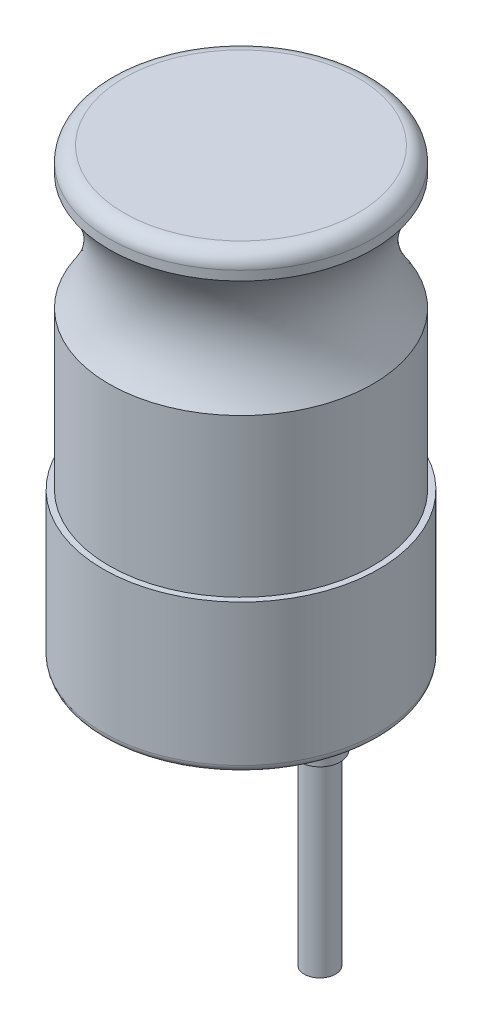
ISO-10303-21;
HEADER;
FILE_DESCRIPTION(('STEP AP214'),'2;1');
FILE_NAME('part.step','',(''),(''),'','','');
FILE_SCHEMA(('AUTOMOTIVE_DESIGN { 1 0 10303 214 1 1 1 1 }'));
ENDSEC;
DATA;
#1=APPLICATION_CONTEXT('core data for automotive mechanical design processes');
#2=APPLICATION_PROTOCOL_DEFINITION('international standard','automotive_design',2000,#1);
#3=PRODUCT_CONTEXT('',#1,'mechanical');
#4=PRODUCT('Part','Part','',(#3));
#5=PRODUCT_RELATED_PRODUCT_CATEGORY('part','',(#4));
#6=PRODUCT_DEFINITION_FORMATION('','',#4);
#7=PRODUCT_DEFINITION_CONTEXT('part definition',#1,'design');
#8=PRODUCT_DEFINITION('design','',#6,#7);
#9=PRODUCT_DEFINITION_SHAPE('','',#8);
#10=(LENGTH_UNIT() NAMED_UNIT(*) SI_UNIT(.MILLI.,.METRE.));
#11=(NAMED_UNIT(*) PLANE_ANGLE_UNIT() SI_UNIT($,.RADIAN.));
#12=(NAMED_UNIT(*) SI_UNIT($,.STERADIAN.) SOLID_ANGLE_UNIT());
#13=UNCERTAINTY_MEASURE_WITH_UNIT(LENGTH_MEASURE(1.E-05),#10,'distance_accuracy_value','');
#14=(GEOMETRIC_REPRESENTATION_CONTEXT(3) GLOBAL_UNCERTAINTY_ASSIGNED_CONTEXT((#13)) GLOBAL_UNIT_ASSIGNED_CONTEXT((#10,
#11,#12)) REPRESENTATION_CONTEXT('',''));
#15=CARTESIAN_POINT('',(0.,0.,0.));
#16=DIRECTION('',(0.,0.,1.));
#17=DIRECTION('',(1.,0.,0.));
#18=AXIS2_PLACEMENT_3D('',#15,#16,#17);
#19=CARTESIAN_POINT('',(0.,60.,0.));
#20=DIRECTION('',(0.,-1.,0.));
#21=DIRECTION('',(0.,0.,-1.));
#22=AXIS2_PLACEMENT_3D('',#19,#20,#21);
#23=CYLINDRICAL_SURFACE('',#22,17.7082900717388);
#24=CARTESIAN_POINT('',(0.,20.,0.));
#25=DIRECTION('',(0.,1.,0.));
#26=DIRECTION('',(0.,0.,1.));
#27=AXIS2_PLACEMENT_3D('',#24,#25,#26);
#28=CIRCLE('',#27,17.7082900717388);
#29=CARTESIAN_POINT('',(0.,20.,17.7082900717388));
#30=VERTEX_POINT('',#29);
#31=EDGE_CURVE('E123',#30,#30,#28,.T.);
#32=ORIENTED_EDGE('',*,*,#31,.T.);
#33=EDGE_LOOP('',(#32));
#34=FACE_BOUND('',#33,.T.);
#35=CARTESIAN_POINT('',(0.,41.1183189695657,0.));
#36=DIRECTION('',(0.,1.,0.));
#37=DIRECTION('',(0.,0.,1.));
#38=AXIS2_PLACEMENT_3D('',#35,#36,#37);
#39=CIRCLE('',#38,17.7082900717388);
#40=CARTESIAN_POINT('',(0.,41.1183189695657,17.7082900717388));
#41=VERTEX_POINT('',#40);
#42=EDGE_CURVE('E53',#41,#41,#39,.T.);
#43=ORIENTED_EDGE('',*,*,#42,.F.);
#44=EDGE_LOOP('',(#43));
#45=FACE_BOUND('',#44,.T.);
#46=ADVANCED_FACE('F32',(#34,#45),#23,.T.);
#47=CARTESIAN_POINT('',(0.,20.,0.));
#48=DIRECTION('',(0.,-1.,0.));
#49=DIRECTION('',(0.,0.,-1.));
#50=AXIS2_PLACEMENT_3D('',#47,#48,#49);
#51=CYLINDRICAL_SURFACE('',#50,18.5);
#52=CARTESIAN_POINT('',(0.,1.,0.));
#53=DIRECTION('',(0.,1.,0.));
#54=DIRECTION('',(0.,0.,1.));
#55=AXIS2_PLACEMENT_3D('',#52,#53,#54);
#56=CIRCLE('',#55,18.5);
#57=CARTESIAN_POINT('',(0.,1.,18.5));
#58=VERTEX_POINT('',#57);
#59=EDGE_CURVE('E43',#58,#58,#56,.T.);
#60=ORIENTED_EDGE('',*,*,#59,.T.);
#61=EDGE_LOOP('',(#60));
#62=FACE_BOUND('',#61,.T.);
#63=CARTESIAN_POINT('',(0.,20.,0.));
#64=DIRECTION('',(0.,1.,0.));
#65=DIRECTION('',(0.,0.,1.));
#66=AXIS2_PLACEMENT_3D('',#63,#64,#65);
#67=CIRCLE('',#66,18.5);
#68=CARTESIAN_POINT('',(0.,20.,18.5));
#69=VERTEX_POINT('',#68);
#70=EDGE_CURVE('E134',#69,#69,#67,.T.);
#71=ORIENTED_EDGE('',*,*,#70,.F.);
#72=EDGE_LOOP('',(#71));
#73=FACE_BOUND('',#72,.T.);
#74=ADVANCED_FACE('F101',(#62,#73),#51,.T.);
#75=CARTESIAN_POINT('',(0.,20.,0.));
#76=DIRECTION('',(0.,1.,0.));
#77=DIRECTION('',(0.,0.,1.));
#78=AXIS2_PLACEMENT_3D('',#75,#76,#77);
#79=PLANE('',#78);
#80=ORIENTED_EDGE('',*,*,#31,.F.);
#81=EDGE_LOOP('',(#80));
#82=FACE_BOUND('',#81,.T.);
#83=ORIENTED_EDGE('',*,*,#70,.T.);
#84=EDGE_LOOP('',(#83));
#85=FACE_BOUND('',#84,.T.);
#86=ADVANCED_FACE('F98',(#82,#85),#79,.T.);
#87=CARTESIAN_POINT('',(0.,0.,0.));
#88=DIRECTION('',(0.,1.,0.));
#89=DIRECTION('',(0.,0.,1.));
#90=AXIS2_PLACEMENT_3D('',#87,#88,#89);
#91=PLANE('',#90);
#92=CARTESIAN_POINT('',(10.5836515385587,0.,0.));
#93=DIRECTION('',(0.,1.,0.));
#94=DIRECTION('',(0.,0.,1.));
#95=AXIS2_PLACEMENT_3D('',#92,#93,#94);
#96=CIRCLE('',#95,2.74870760067832);
#97=CARTESIAN_POINT('',(10.5836515385587,0.,2.74870760067832));
#98=VERTEX_POINT('',#97);
#99=EDGE_CURVE('E10',#98,#98,#96,.F.);
#100=ORIENTED_EDGE('',*,*,#99,.F.);
#101=EDGE_LOOP('',(#100));
#102=FACE_BOUND('',#101,.T.);
#103=CARTESIAN_POINT('',(0.,0.,0.));
#104=DIRECTION('',(0.,1.,0.));
#105=DIRECTION('',(0.,0.,1.));
#106=AXIS2_PLACEMENT_3D('',#103,#104,#105);
#107=CIRCLE('',#106,17.5);
#108=CARTESIAN_POINT('',(0.,0.,17.5));
#109=VERTEX_POINT('',#108);
#110=EDGE_CURVE('E39',#109,#109,#107,.F.);
#111=ORIENTED_EDGE('',*,*,#110,.T.);
#112=EDGE_LOOP('',(#111));
#113=FACE_BOUND('',#112,.T.);
#114=ADVANCED_FACE('F78',(#102,#113),#91,.F.);
#115=CARTESIAN_POINT('',(0.,56.7534358715261,17.7082900717388));
#116=CARTESIAN_POINT('',(0.,49.2397613994028,12.0887296047305));
#117=CARTESIAN_POINT('',(0.,41.1183189695657,17.7082900717388));
#118=B_SPLINE_CURVE_WITH_KNOTS('',2,(#115,#116,#117),.UNSPECIFIED.,.F.,.F.,(3,3),(0.,1.),.UNSPECIFIED.);
#119=CARTESIAN_POINT('',(0.,60.,0.));
#120=DIRECTION('',(0.,1.,0.));
#121=AXIS1_PLACEMENT('',#119,#120);
#122=SURFACE_OF_REVOLUTION('',#118,#121);
#123=ORIENTED_EDGE('',*,*,#42,.T.);
#124=EDGE_LOOP('',(#123));
#125=FACE_BOUND('',#124,.T.);
#126=CARTESIAN_POINT('',(0.,56.7534358715261,0.));
#127=DIRECTION('',(0.,1.,0.));
#128=DIRECTION('',(0.,0.,1.));
#129=AXIS2_PLACEMENT_3D('',#126,#127,#128);
#130=CIRCLE('',#129,17.7082900717388);
#131=CARTESIAN_POINT('',(0.,56.7534358715261,17.7082900717388));
#132=VERTEX_POINT('',#131);
#133=EDGE_CURVE('E58',#132,#132,#130,.T.);
#134=ORIENTED_EDGE('',*,*,#133,.F.);
#135=EDGE_LOOP('',(#134));
#136=FACE_BOUND('',#135,.T.);
#137=ADVANCED_FACE('F73',(#125,#136),#122,.F.);
#138=CARTESIAN_POINT('',(0.,60.,0.));
#139=DIRECTION('',(0.,1.,0.));
#140=DIRECTION('',(0.,0.,1.));
#141=AXIS2_PLACEMENT_3D('',#138,#139,#140);
#142=PLANE('',#141);
#143=CARTESIAN_POINT('',(0.,60.,0.));
#144=DIRECTION('',(0.,1.,0.));
#145=DIRECTION('',(0.,0.,1.));
#146=AXIS2_PLACEMENT_3D('',#143,#144,#145);
#147=CIRCLE('',#146,15.7082900717388);
#148=CARTESIAN_POINT('',(0.,60.,15.7082900717388));
#149=VERTEX_POINT('',#148);
#150=EDGE_CURVE('E137',#149,#149,#147,.T.);
#151=ORIENTED_EDGE('',*,*,#150,.T.);
#152=EDGE_LOOP('',(#151));
#153=FACE_BOUND('',#152,.T.);
#154=ADVANCED_FACE('F77',(#153),#142,.T.);
#155=CARTESIAN_POINT('',(0.,58.,0.));
#156=DIRECTION('',(0.,1.,0.));
#157=DIRECTION('',(0.,0.,1.));
#158=AXIS2_PLACEMENT_3D('',#155,#156,#157);
#159=CIRCLE('',#158,17.7082900717388);
#160=CARTESIAN_POINT('',(0.,58.,17.7082900717388));
#161=VERTEX_POINT('',#160);
#162=EDGE_CURVE('E48',#161,#161,#159,.F.);
#163=ORIENTED_EDGE('',*,*,#162,.T.);
#164=EDGE_LOOP('',(#163));
#165=FACE_BOUND('',#164,.T.);
#166=ORIENTED_EDGE('',*,*,#133,.T.);
#167=EDGE_LOOP('',(#166));
#168=FACE_BOUND('',#167,.T.);
#169=ADVANCED_FACE('F92',(#165,#168),#23,.T.);
#170=CARTESIAN_POINT('',(0.,58.,0.));
#171=DIRECTION('',(0.,1.,0.));
#172=DIRECTION('',(0.,0.,1.));
#173=AXIS2_PLACEMENT_3D('',#170,#171,#172);
#174=TOROIDAL_SURFACE('',#173,15.7082900717388,2.);
#175=ORIENTED_EDGE('',*,*,#162,.F.);
#176=EDGE_LOOP('',(#175));
#177=FACE_BOUND('',#176,.T.);
#178=ORIENTED_EDGE('',*,*,#150,.F.);
#179=EDGE_LOOP('',(#178));
#180=FACE_BOUND('',#179,.T.);
#181=ADVANCED_FACE('F96',(#177,#180),#174,.T.);
#182=CARTESIAN_POINT('',(0.,1.,0.));
#183=DIRECTION('',(0.,1.,0.));
#184=DIRECTION('',(0.,0.,1.));
#185=AXIS2_PLACEMENT_3D('',#182,#183,#184);
#186=TOROIDAL_SURFACE('',#185,17.5,1.);
#187=ORIENTED_EDGE('',*,*,#110,.F.);
#188=EDGE_LOOP('',(#187));
#189=FACE_BOUND('',#188,.T.);
#190=ORIENTED_EDGE('',*,*,#59,.F.);
#191=EDGE_LOOP('',(#190));
#192=FACE_BOUND('',#191,.T.);
#193=ADVANCED_FACE('F34',(#189,#192),#186,.T.);
#194=CARTESIAN_POINT('',(10.5836515385587,-5.,0.));
#195=DIRECTION('',(0.,1.,0.));
#196=DIRECTION('',(0.,0.,1.));
#197=AXIS2_PLACEMENT_3D('',#194,#195,#196);
#198=CYLINDRICAL_SURFACE('',#197,2.74870760067832);
#199=CARTESIAN_POINT('',(10.5836515385587,-5.,0.));
#200=DIRECTION('',(0.,-1.,0.));
#201=DIRECTION('',(0.,0.,-1.));
#202=AXIS2_PLACEMENT_3D('',#199,#200,#201);
#203=CIRCLE('',#202,2.74870760067832);
#204=CARTESIAN_POINT('',(10.5836515385587,-5.,-2.74870760067832));
#205=VERTEX_POINT('',#204);
#206=EDGE_CURVE('E54',#205,#205,#203,.T.);
#207=ORIENTED_EDGE('',*,*,#206,.F.);
#208=EDGE_LOOP('',(#207));
#209=FACE_BOUND('',#208,.T.);
#210=ORIENTED_EDGE('',*,*,#99,.T.);
#211=EDGE_LOOP('',(#210));
#212=FACE_BOUND('',#211,.T.);
#213=ADVANCED_FACE('F80',(#209,#212),#198,.T.);
#214=CARTESIAN_POINT('',(10.5836515385587,-5.,0.));
#215=DIRECTION('',(0.,-1.,0.));
#216=DIRECTION('',(0.,0.,-1.));
#217=AXIS2_PLACEMENT_3D('',#214,#215,#216);
#218=PLANE('',#217);
#219=CARTESIAN_POINT('',(10.5836515385587,-5.,0.));
#220=DIRECTION('',(0.,-1.,0.));
#221=DIRECTION('',(0.,0.,-1.));
#222=AXIS2_PLACEMENT_3D('',#219,#220,#221);
#223=CIRCLE('',#222,2.09331498550342);
#224=CARTESIAN_POINT('',(10.5836515385587,-5.,-2.09331498550342));
#225=VERTEX_POINT('',#224);
#226=EDGE_CURVE('E51',#225,#225,#223,.T.);
#227=ORIENTED_EDGE('',*,*,#226,.F.);
#228=EDGE_LOOP('',(#227));
#229=FACE_BOUND('',#228,.T.);
#230=ORIENTED_EDGE('',*,*,#206,.T.);
#231=EDGE_LOOP('',(#230));
#232=FACE_BOUND('',#231,.T.);
#233=ADVANCED_FACE('F86',(#229,#232),#218,.T.);
#234=CARTESIAN_POINT('',(10.5836515385587,-30.,0.));
#235=DIRECTION('',(0.,-1.,0.));
#236=DIRECTION('',(0.,0.,-1.));
#237=AXIS2_PLACEMENT_3D('',#234,#235,#236);
#238=PLANE('',#237);
#239=CARTESIAN_POINT('',(10.5836515385587,-30.,0.));
#240=DIRECTION('',(0.,-1.,0.));
#241=DIRECTION('',(0.,0.,-1.));
#242=AXIS2_PLACEMENT_3D('',#239,#240,#241);
#243=CIRCLE('',#242,2.09331498550342);
#244=CARTESIAN_POINT('',(10.5836515385587,-30.,-2.09331498550342));
#245=VERTEX_POINT('',#244);
#246=EDGE_CURVE('E129',#245,#245,#243,.T.);
#247=ORIENTED_EDGE('',*,*,#246,.T.);
#248=EDGE_LOOP('',(#247));
#249=FACE_BOUND('',#248,.T.);
#250=ADVANCED_FACE('F82',(#249),#238,.T.);
#251=CARTESIAN_POINT('',(10.5836515385587,-30.,0.));
#252=DIRECTION('',(0.,1.,0.));
#253=DIRECTION('',(0.,0.,1.));
#254=AXIS2_PLACEMENT_3D('',#251,#252,#253);
#255=CYLINDRICAL_SURFACE('',#254,2.09331498550342);
#256=ORIENTED_EDGE('',*,*,#226,.T.);
#257=EDGE_LOOP('',(#256));
#258=FACE_BOUND('',#257,.T.);
#259=ORIENTED_EDGE('',*,*,#246,.F.);
#260=EDGE_LOOP('',(#259));
#261=FACE_BOUND('',#260,.T.);
#262=ADVANCED_FACE('F85',(#258,#261),#255,.T.);
#263=CLOSED_SHELL('',(#46,#74,#86,#114,#137,#154,#169,#181,#193,#213,#233,#250,#262));
#264=MANIFOLD_SOLID_BREP('B2',#263);
#265=ADVANCED_BREP_SHAPE_REPRESENTATION('',(#18,#264),#14);
#266=SHAPE_DEFINITION_REPRESENTATION(#9,#265);
ENDSEC;
END-ISO-10303-21;
